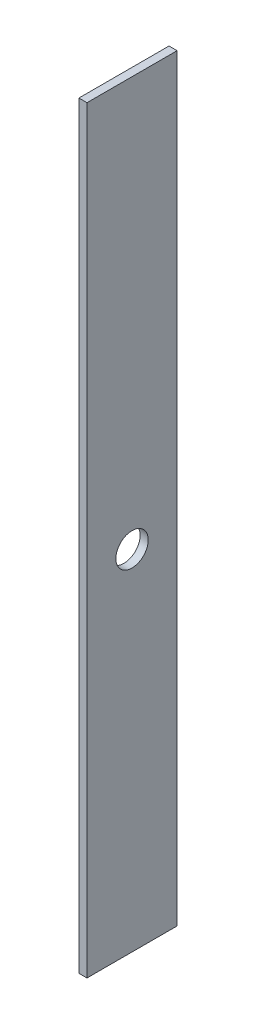
ISO-10303-21;
HEADER;
FILE_DESCRIPTION(('STEP AP214'),'2;1');
FILE_NAME('part.step','',(''),(''),'','','');
FILE_SCHEMA(('AUTOMOTIVE_DESIGN { 1 0 10303 214 1 1 1 1 }'));
ENDSEC;
DATA;
#1=APPLICATION_CONTEXT('core data for automotive mechanical design processes');
#2=APPLICATION_PROTOCOL_DEFINITION('international standard','automotive_design',2000,#1);
#3=PRODUCT_CONTEXT('',#1,'mechanical');
#4=PRODUCT('Part','Part','',(#3));
#5=PRODUCT_RELATED_PRODUCT_CATEGORY('part','',(#4));
#6=PRODUCT_DEFINITION_FORMATION('','',#4);
#7=PRODUCT_DEFINITION_CONTEXT('part definition',#1,'design');
#8=PRODUCT_DEFINITION('design','',#6,#7);
#9=PRODUCT_DEFINITION_SHAPE('','',#8);
#10=(LENGTH_UNIT() NAMED_UNIT(*) SI_UNIT(.MILLI.,.METRE.));
#11=(NAMED_UNIT(*) PLANE_ANGLE_UNIT() SI_UNIT($,.RADIAN.));
#12=(NAMED_UNIT(*) SI_UNIT($,.STERADIAN.) SOLID_ANGLE_UNIT());
#13=UNCERTAINTY_MEASURE_WITH_UNIT(LENGTH_MEASURE(1.E-05),#10,'distance_accuracy_value','');
#14=(GEOMETRIC_REPRESENTATION_CONTEXT(3) GLOBAL_UNCERTAINTY_ASSIGNED_CONTEXT((#13)) GLOBAL_UNIT_ASSIGNED_CONTEXT((#10,
#11,#12)) REPRESENTATION_CONTEXT('',''));
#15=CARTESIAN_POINT('',(0.,0.,0.));
#16=DIRECTION('',(0.,0.,1.));
#17=DIRECTION('',(1.,0.,0.));
#18=AXIS2_PLACEMENT_3D('',#15,#16,#17);
#19=CARTESIAN_POINT('',(1.5,0.,0.));
#20=DIRECTION('',(1.,0.,0.));
#21=DIRECTION('',(0.,0.,-1.));
#22=AXIS2_PLACEMENT_3D('',#19,#20,#21);
#23=PLANE('',#22);
#24=DIRECTION('',(0.,1.,0.));
#25=VECTOR('',#24,1.);
#26=CARTESIAN_POINT('',(1.5,-219.134944622619,318.429752094618));
#27=LINE('',#26,#25);
#28=CARTESIAN_POINT('',(1.5,-219.134944622619,318.429752094618));
#29=VERTEX_POINT('',#28);
#30=CARTESIAN_POINT('',(1.5,-78.5158513578063,318.429752094618));
#31=VERTEX_POINT('',#30);
#32=EDGE_CURVE('E91',#29,#31,#27,.T.);
#33=ORIENTED_EDGE('',*,*,#32,.T.);
#34=DIRECTION('',(0.,0.,1.));
#35=VECTOR('',#34,1.);
#36=CARTESIAN_POINT('',(1.5,-78.5158513578063,318.429752094618));
#37=LINE('',#36,#35);
#38=CARTESIAN_POINT('',(1.5,-78.5158513578063,335.143752094619));
#39=VERTEX_POINT('',#38);
#40=EDGE_CURVE('E86',#31,#39,#37,.T.);
#41=ORIENTED_EDGE('',*,*,#40,.T.);
#42=DIRECTION('',(0.,-1.,0.));
#43=VECTOR('',#42,1.);
#44=CARTESIAN_POINT('',(1.5,-78.5158513578063,335.143752094619));
#45=LINE('',#44,#43);
#46=CARTESIAN_POINT('',(1.5,-219.134944622619,335.143752094618));
#47=VERTEX_POINT('',#46);
#48=EDGE_CURVE('E89',#39,#47,#45,.T.);
#49=ORIENTED_EDGE('',*,*,#48,.T.);
#50=DIRECTION('',(0.,0.,-1.));
#51=VECTOR('',#50,1.);
#52=CARTESIAN_POINT('',(1.5,-219.134944622619,335.143752094618));
#53=LINE('',#52,#51);
#54=EDGE_CURVE('E56',#47,#29,#53,.T.);
#55=ORIENTED_EDGE('',*,*,#54,.T.);
#56=EDGE_LOOP('',(#33,#41,#49,#55));
#57=FACE_BOUND('',#56,.T.);
#58=CARTESIAN_POINT('',(1.5,-154.442358108989,326.786752094628));
#59=DIRECTION('',(1.,0.,0.));
#60=DIRECTION('',(0.,0.,-1.));
#61=AXIS2_PLACEMENT_3D('',#58,#59,#60);
#62=CIRCLE('',#61,2.99999999999999);
#63=CARTESIAN_POINT('',(1.5,-154.442358108989,323.786752094628));
#64=VERTEX_POINT('',#63);
#65=EDGE_CURVE('E106',#64,#64,#62,.T.);
#66=ORIENTED_EDGE('',*,*,#65,.F.);
#67=EDGE_LOOP('',(#66));
#68=FACE_BOUND('',#67,.T.);
#69=ADVANCED_FACE('F39',(#57,#68),#23,.T.);
#70=CARTESIAN_POINT('',(0.,0.,0.));
#71=DIRECTION('',(1.,0.,0.));
#72=DIRECTION('',(0.,0.,-1.));
#73=AXIS2_PLACEMENT_3D('',#70,#71,#72);
#74=PLANE('',#73);
#75=DIRECTION('',(0.,1.,0.));
#76=VECTOR('',#75,1.);
#77=CARTESIAN_POINT('',(0.,-219.134944622619,318.429752094618));
#78=LINE('',#77,#76);
#79=CARTESIAN_POINT('',(0.,-219.134944622619,318.429752094618));
#80=VERTEX_POINT('',#79);
#81=CARTESIAN_POINT('',(0.,-78.5158513578063,318.429752094618));
#82=VERTEX_POINT('',#81);
#83=EDGE_CURVE('E103',#80,#82,#78,.T.);
#84=ORIENTED_EDGE('',*,*,#83,.F.);
#85=DIRECTION('',(0.,0.,-1.));
#86=VECTOR('',#85,1.);
#87=CARTESIAN_POINT('',(0.,-219.134944622619,335.143752094618));
#88=LINE('',#87,#86);
#89=CARTESIAN_POINT('',(0.,-219.134944622619,335.143752094618));
#90=VERTEX_POINT('',#89);
#91=EDGE_CURVE('E79',#90,#80,#88,.T.);
#92=ORIENTED_EDGE('',*,*,#91,.F.);
#93=DIRECTION('',(0.,-1.,0.));
#94=VECTOR('',#93,1.);
#95=CARTESIAN_POINT('',(0.,-78.5158513578063,335.143752094619));
#96=LINE('',#95,#94);
#97=CARTESIAN_POINT('',(0.,-78.5158513578063,335.143752094619));
#98=VERTEX_POINT('',#97);
#99=EDGE_CURVE('E73',#98,#90,#96,.T.);
#100=ORIENTED_EDGE('',*,*,#99,.F.);
#101=DIRECTION('',(0.,0.,1.));
#102=VECTOR('',#101,1.);
#103=CARTESIAN_POINT('',(0.,-78.5158513578063,318.429752094618));
#104=LINE('',#103,#102);
#105=EDGE_CURVE('E95',#82,#98,#104,.T.);
#106=ORIENTED_EDGE('',*,*,#105,.F.);
#107=EDGE_LOOP('',(#84,#92,#100,#106));
#108=FACE_BOUND('',#107,.T.);
#109=CARTESIAN_POINT('',(0.,-154.442358108989,326.786752094628));
#110=DIRECTION('',(1.,0.,0.));
#111=DIRECTION('',(0.,0.,-1.));
#112=AXIS2_PLACEMENT_3D('',#109,#110,#111);
#113=CIRCLE('',#112,2.99999999999999);
#114=CARTESIAN_POINT('',(0.,-154.442358108989,323.786752094628));
#115=VERTEX_POINT('',#114);
#116=EDGE_CURVE('E118',#115,#115,#113,.T.);
#117=ORIENTED_EDGE('',*,*,#116,.T.);
#118=EDGE_LOOP('',(#117));
#119=FACE_BOUND('',#118,.T.);
#120=ADVANCED_FACE('F114',(#108,#119),#74,.F.);
#121=CARTESIAN_POINT('',(1.5,-219.134944622619,318.429752094618));
#122=DIRECTION('',(0.,0.,1.));
#123=DIRECTION('',(1.,0.,0.));
#124=AXIS2_PLACEMENT_3D('',#121,#122,#123);
#125=PLANE('',#124);
#126=ORIENTED_EDGE('',*,*,#83,.T.);
#127=DIRECTION('',(-1.,0.,0.));
#128=VECTOR('',#127,1.);
#129=CARTESIAN_POINT('',(1.5,-78.5158513578063,318.429752094618));
#130=LINE('',#129,#128);
#131=EDGE_CURVE('E11',#31,#82,#130,.T.);
#132=ORIENTED_EDGE('',*,*,#131,.F.);
#133=ORIENTED_EDGE('',*,*,#32,.F.);
#134=DIRECTION('',(-1.,0.,0.));
#135=VECTOR('',#134,1.);
#136=CARTESIAN_POINT('',(1.5,-219.134944622619,318.429752094618));
#137=LINE('',#136,#135);
#138=EDGE_CURVE('E99',#29,#80,#137,.T.);
#139=ORIENTED_EDGE('',*,*,#138,.T.);
#140=EDGE_LOOP('',(#126,#132,#133,#139));
#141=FACE_BOUND('',#140,.T.);
#142=ADVANCED_FACE('F41',(#141),#125,.F.);
#143=CARTESIAN_POINT('',(1.5,-78.5158513578063,318.429752094618));
#144=DIRECTION('',(0.,-1.,0.));
#145=DIRECTION('',(0.,0.,-1.));
#146=AXIS2_PLACEMENT_3D('',#143,#144,#145);
#147=PLANE('',#146);
#148=ORIENTED_EDGE('',*,*,#105,.T.);
#149=DIRECTION('',(-1.,0.,0.));
#150=VECTOR('',#149,1.);
#151=CARTESIAN_POINT('',(1.5,-78.5158513578063,335.143752094619));
#152=LINE('',#151,#150);
#153=EDGE_CURVE('E48',#39,#98,#152,.T.);
#154=ORIENTED_EDGE('',*,*,#153,.F.);
#155=ORIENTED_EDGE('',*,*,#40,.F.);
#156=ORIENTED_EDGE('',*,*,#131,.T.);
#157=EDGE_LOOP('',(#148,#154,#155,#156));
#158=FACE_BOUND('',#157,.T.);
#159=ADVANCED_FACE('F94',(#158),#147,.F.);
#160=CARTESIAN_POINT('',(1.5,-78.5158513578063,335.143752094619));
#161=DIRECTION('',(0.,0.,-1.));
#162=DIRECTION('',(0.,1.,0.));
#163=AXIS2_PLACEMENT_3D('',#160,#161,#162);
#164=PLANE('',#163);
#165=ORIENTED_EDGE('',*,*,#99,.T.);
#166=DIRECTION('',(-1.,0.,0.));
#167=VECTOR('',#166,1.);
#168=CARTESIAN_POINT('',(1.5,-219.134944622619,335.143752094618));
#169=LINE('',#168,#167);
#170=EDGE_CURVE('E96',#47,#90,#169,.T.);
#171=ORIENTED_EDGE('',*,*,#170,.F.);
#172=ORIENTED_EDGE('',*,*,#48,.F.);
#173=ORIENTED_EDGE('',*,*,#153,.T.);
#174=EDGE_LOOP('',(#165,#171,#172,#173));
#175=FACE_BOUND('',#174,.T.);
#176=ADVANCED_FACE('F97',(#175),#164,.F.);
#177=CARTESIAN_POINT('',(1.5,-219.134944622619,335.143752094618));
#178=DIRECTION('',(0.,1.,0.));
#179=DIRECTION('',(0.,0.,1.));
#180=AXIS2_PLACEMENT_3D('',#177,#178,#179);
#181=PLANE('',#180);
#182=ORIENTED_EDGE('',*,*,#91,.T.);
#183=ORIENTED_EDGE('',*,*,#138,.F.);
#184=ORIENTED_EDGE('',*,*,#54,.F.);
#185=ORIENTED_EDGE('',*,*,#170,.T.);
#186=EDGE_LOOP('',(#182,#183,#184,#185));
#187=FACE_BOUND('',#186,.T.);
#188=ADVANCED_FACE('F111',(#187),#181,.F.);
#189=CARTESIAN_POINT('',(1.5,-154.442358108989,326.786752094628));
#190=DIRECTION('',(-1.,0.,0.));
#191=DIRECTION('',(0.,0.,1.));
#192=AXIS2_PLACEMENT_3D('',#189,#190,#191);
#193=CYLINDRICAL_SURFACE('',#192,2.99999999999999);
#194=ORIENTED_EDGE('',*,*,#65,.T.);
#195=EDGE_LOOP('',(#194));
#196=FACE_BOUND('',#195,.T.);
#197=ORIENTED_EDGE('',*,*,#116,.F.);
#198=EDGE_LOOP('',(#197));
#199=FACE_BOUND('',#198,.T.);
#200=ADVANCED_FACE('F124',(#196,#199),#193,.F.);
#201=CLOSED_SHELL('',(#69,#120,#142,#159,#176,#188,#200));
#202=MANIFOLD_SOLID_BREP('B2',#201);
#203=ADVANCED_BREP_SHAPE_REPRESENTATION('',(#18,#202),#14);
#204=SHAPE_DEFINITION_REPRESENTATION(#9,#203);
ENDSEC;
END-ISO-10303-21;
